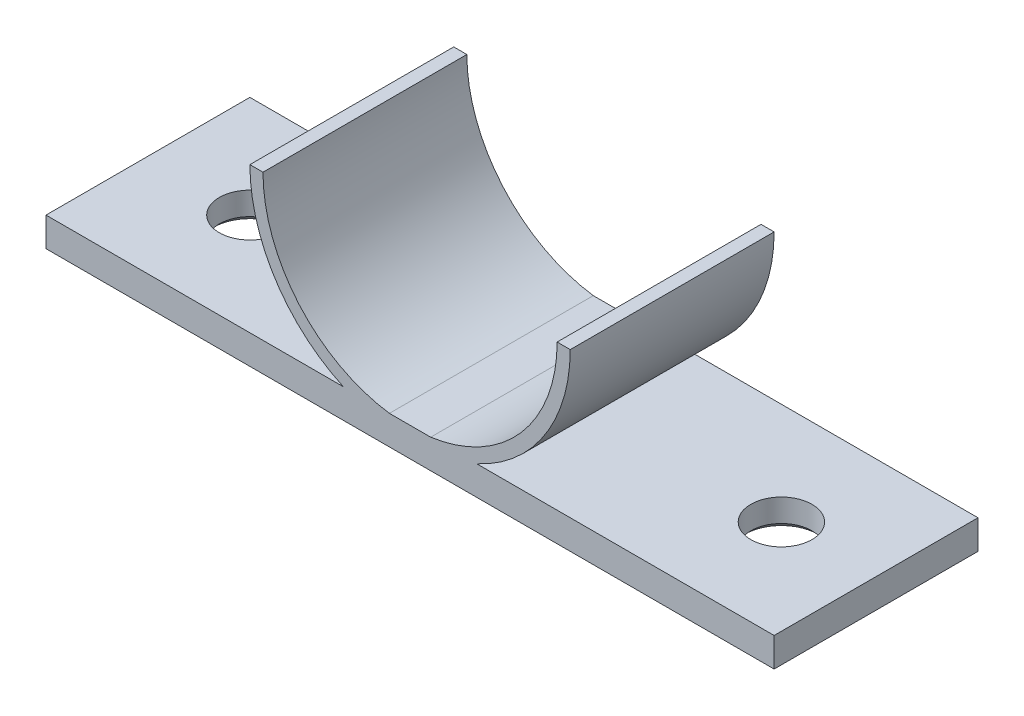
ISO-10303-21;
HEADER;
FILE_DESCRIPTION(('STEP AP214'),'2;1');
FILE_NAME('part.step','',(''),(''),'','','');
FILE_SCHEMA(('AUTOMOTIVE_DESIGN { 1 0 10303 214 1 1 1 1 }'));
ENDSEC;
DATA;
#1=APPLICATION_CONTEXT('core data for automotive mechanical design processes');
#2=APPLICATION_PROTOCOL_DEFINITION('international standard','automotive_design',2000,#1);
#3=PRODUCT_CONTEXT('',#1,'mechanical');
#4=PRODUCT('Part','Part','',(#3));
#5=PRODUCT_RELATED_PRODUCT_CATEGORY('part','',(#4));
#6=PRODUCT_DEFINITION_FORMATION('','',#4);
#7=PRODUCT_DEFINITION_CONTEXT('part definition',#1,'design');
#8=PRODUCT_DEFINITION('design','',#6,#7);
#9=PRODUCT_DEFINITION_SHAPE('','',#8);
#10=(LENGTH_UNIT() NAMED_UNIT(*) SI_UNIT(.MILLI.,.METRE.));
#11=(NAMED_UNIT(*) PLANE_ANGLE_UNIT() SI_UNIT($,.RADIAN.));
#12=(NAMED_UNIT(*) SI_UNIT($,.STERADIAN.) SOLID_ANGLE_UNIT());
#13=UNCERTAINTY_MEASURE_WITH_UNIT(LENGTH_MEASURE(1.E-05),#10,'distance_accuracy_value','');
#14=(GEOMETRIC_REPRESENTATION_CONTEXT(3) GLOBAL_UNCERTAINTY_ASSIGNED_CONTEXT((#13)) GLOBAL_UNIT_ASSIGNED_CONTEXT((#10,
#11,#12)) REPRESENTATION_CONTEXT('',''));
#15=CARTESIAN_POINT('',(0.,0.,0.));
#16=DIRECTION('',(0.,0.,1.));
#17=DIRECTION('',(1.,0.,0.));
#18=AXIS2_PLACEMENT_3D('',#15,#16,#17);
#19=CARTESIAN_POINT('',(0.,2.,0.));
#20=DIRECTION('',(0.,-1.,0.));
#21=DIRECTION('',(0.,0.,-1.));
#22=AXIS2_PLACEMENT_3D('',#19,#20,#21);
#23=PLANE('',#22);
#24=DIRECTION('',(1.,0.,0.));
#25=VECTOR('',#24,1.);
#26=CARTESIAN_POINT('',(0.,2.,0.));
#27=LINE('',#26,#25);
#28=CARTESIAN_POINT('',(23.5822553121243,2.,0.));
#29=VERTEX_POINT('',#28);
#30=CARTESIAN_POINT('',(26.4177446878757,2.,0.));
#31=VERTEX_POINT('',#30);
#32=EDGE_CURVE('E63',#29,#31,#27,.T.);
#33=ORIENTED_EDGE('',*,*,#32,.T.);
#34=DIRECTION('',(0.,0.,1.));
#35=VECTOR('',#34,1.);
#36=CARTESIAN_POINT('',(26.4177446878757,2.,-14.));
#37=LINE('',#36,#35);
#38=CARTESIAN_POINT('',(26.4177446878757,2.,-14.));
#39=VERTEX_POINT('',#38);
#40=EDGE_CURVE('E67',#39,#31,#37,.T.);
#41=ORIENTED_EDGE('',*,*,#40,.F.);
#42=DIRECTION('',(-1.,0.,0.));
#43=VECTOR('',#42,1.);
#44=CARTESIAN_POINT('',(0.,2.,-14.));
#45=LINE('',#44,#43);
#46=CARTESIAN_POINT('',(23.5822553121243,2.,-14.));
#47=VERTEX_POINT('',#46);
#48=EDGE_CURVE('E230',#39,#47,#45,.T.);
#49=ORIENTED_EDGE('',*,*,#48,.T.);
#50=DIRECTION('',(0.,0.,1.));
#51=VECTOR('',#50,1.);
#52=CARTESIAN_POINT('',(23.5822553121243,2.,-14.));
#53=LINE('',#52,#51);
#54=EDGE_CURVE('E207',#47,#29,#53,.T.);
#55=ORIENTED_EDGE('',*,*,#54,.T.);
#56=EDGE_LOOP('',(#33,#41,#49,#55));
#57=FACE_BOUND('',#56,.T.);
#58=ADVANCED_FACE('F45',(#57),#23,.F.);
#59=CARTESIAN_POINT('',(7.,2.,-7.));
#60=DIRECTION('',(0.,-1.,0.));
#61=DIRECTION('',(0.,0.,-1.));
#62=AXIS2_PLACEMENT_3D('',#59,#60,#61);
#63=CIRCLE('',#62,2.09999999999999);
#64=CARTESIAN_POINT('',(7.,2.,-9.09999999999999));
#65=VERTEX_POINT('',#64);
#66=EDGE_CURVE('E49',#65,#65,#63,.T.);
#67=ORIENTED_EDGE('',*,*,#66,.T.);
#68=EDGE_LOOP('',(#67));
#69=FACE_BOUND('',#68,.T.);
#70=DIRECTION('',(0.,0.,1.));
#71=VECTOR('',#70,1.);
#72=CARTESIAN_POINT('',(20.4174243050442,2.,-14.));
#73=LINE('',#72,#71);
#74=CARTESIAN_POINT('',(20.4174243050442,2.,-14.));
#75=VERTEX_POINT('',#74);
#76=CARTESIAN_POINT('',(20.4174243050442,2.,0.));
#77=VERTEX_POINT('',#76);
#78=EDGE_CURVE('E189',#75,#77,#73,.T.);
#79=ORIENTED_EDGE('',*,*,#78,.F.);
#80=CARTESIAN_POINT('',(0.,2.,-14.));
#81=VERTEX_POINT('',#80);
#82=EDGE_CURVE('E225',#75,#81,#45,.T.);
#83=ORIENTED_EDGE('',*,*,#82,.T.);
#84=DIRECTION('',(0.,0.,1.));
#85=VECTOR('',#84,1.);
#86=CARTESIAN_POINT('',(0.,2.,0.));
#87=LINE('',#86,#85);
#88=CARTESIAN_POINT('',(0.,2.,0.));
#89=VERTEX_POINT('',#88);
#90=EDGE_CURVE('E212',#81,#89,#87,.T.);
#91=ORIENTED_EDGE('',*,*,#90,.T.);
#92=EDGE_CURVE('E218',#89,#77,#27,.T.);
#93=ORIENTED_EDGE('',*,*,#92,.T.);
#94=EDGE_LOOP('',(#79,#83,#91,#93));
#95=FACE_BOUND('',#94,.T.);
#96=ADVANCED_FACE('F288',(#69,#95),#23,.F.);
#97=CARTESIAN_POINT('',(0.,2.,0.));
#98=DIRECTION('',(1.,0.,0.));
#99=DIRECTION('',(0.,0.,-1.));
#100=AXIS2_PLACEMENT_3D('',#97,#98,#99);
#101=PLANE('',#100);
#102=DIRECTION('',(0.,0.,1.));
#103=VECTOR('',#102,1.);
#104=CARTESIAN_POINT('',(0.,0.,0.));
#105=LINE('',#104,#103);
#106=CARTESIAN_POINT('',(0.,0.,-14.));
#107=VERTEX_POINT('',#106);
#108=CARTESIAN_POINT('',(0.,0.,0.));
#109=VERTEX_POINT('',#108);
#110=EDGE_CURVE('E203',#107,#109,#105,.T.);
#111=ORIENTED_EDGE('',*,*,#110,.T.);
#112=DIRECTION('',(0.,-1.,0.));
#113=VECTOR('',#112,1.);
#114=CARTESIAN_POINT('',(0.,2.,0.));
#115=LINE('',#114,#113);
#116=EDGE_CURVE('E11',#89,#109,#115,.T.);
#117=ORIENTED_EDGE('',*,*,#116,.F.);
#118=ORIENTED_EDGE('',*,*,#90,.F.);
#119=DIRECTION('',(0.,-1.,0.));
#120=VECTOR('',#119,1.);
#121=CARTESIAN_POINT('',(0.,2.,-14.));
#122=LINE('',#121,#120);
#123=EDGE_CURVE('E229',#81,#107,#122,.T.);
#124=ORIENTED_EDGE('',*,*,#123,.T.);
#125=EDGE_LOOP('',(#111,#117,#118,#124));
#126=FACE_BOUND('',#125,.T.);
#127=ADVANCED_FACE('F47',(#126),#101,.F.);
#128=CARTESIAN_POINT('',(0.,2.,0.));
#129=DIRECTION('',(0.,0.,-1.));
#130=DIRECTION('',(-1.,0.,0.));
#131=AXIS2_PLACEMENT_3D('',#128,#129,#130);
#132=PLANE('',#131);
#133=DIRECTION('',(1.,0.,0.));
#134=VECTOR('',#133,1.);
#135=CARTESIAN_POINT('',(0.,0.,0.));
#136=LINE('',#135,#134);
#137=CARTESIAN_POINT('',(50.,0.,0.));
#138=VERTEX_POINT('',#137);
#139=EDGE_CURVE('E234',#109,#138,#136,.T.);
#140=ORIENTED_EDGE('',*,*,#139,.T.);
#141=DIRECTION('',(0.,-1.,0.));
#142=VECTOR('',#141,1.);
#143=CARTESIAN_POINT('',(50.,2.,0.));
#144=LINE('',#143,#142);
#145=CARTESIAN_POINT('',(50.,2.,0.));
#146=VERTEX_POINT('',#145);
#147=EDGE_CURVE('E55',#146,#138,#144,.T.);
#148=ORIENTED_EDGE('',*,*,#147,.F.);
#149=CARTESIAN_POINT('',(29.5825756949558,2.,0.));
#150=VERTEX_POINT('',#149);
#151=EDGE_CURVE('E216',#150,#146,#27,.T.);
#152=ORIENTED_EDGE('',*,*,#151,.F.);
#153=CARTESIAN_POINT('',(25.,12.,0.));
#154=DIRECTION('',(0.,0.,1.));
#155=DIRECTION('',(1.,0.,0.));
#156=AXIS2_PLACEMENT_3D('',#153,#154,#155);
#157=CIRCLE('',#156,11.);
#158=CARTESIAN_POINT('',(36.,12.,0.));
#159=VERTEX_POINT('',#158);
#160=EDGE_CURVE('E156',#150,#159,#157,.T.);
#161=ORIENTED_EDGE('',*,*,#160,.T.);
#162=DIRECTION('',(-1.,0.,0.));
#163=VECTOR('',#162,1.);
#164=CARTESIAN_POINT('',(36.,12.,0.));
#165=LINE('',#164,#163);
#166=CARTESIAN_POINT('',(35.1,12.,0.));
#167=VERTEX_POINT('',#166);
#168=EDGE_CURVE('E140',#159,#167,#165,.T.);
#169=ORIENTED_EDGE('',*,*,#168,.T.);
#170=CARTESIAN_POINT('',(25.,12.,0.));
#171=DIRECTION('',(0.,0.,-1.));
#172=DIRECTION('',(1.,0.,0.));
#173=AXIS2_PLACEMENT_3D('',#170,#171,#172);
#174=CIRCLE('',#173,10.1);
#175=EDGE_CURVE('E151',#167,#31,#174,.T.);
#176=ORIENTED_EDGE('',*,*,#175,.T.);
#177=ORIENTED_EDGE('',*,*,#32,.F.);
#178=CARTESIAN_POINT('',(25.,12.,0.));
#179=DIRECTION('',(0.,0.,-1.));
#180=DIRECTION('',(1.,0.,0.));
#181=AXIS2_PLACEMENT_3D('',#178,#179,#180);
#182=CIRCLE('',#181,10.1);
#183=CARTESIAN_POINT('',(14.9,12.,0.));
#184=VERTEX_POINT('',#183);
#185=EDGE_CURVE('E193',#29,#184,#182,.T.);
#186=ORIENTED_EDGE('',*,*,#185,.T.);
#187=DIRECTION('',(-1.,0.,0.));
#188=VECTOR('',#187,1.);
#189=CARTESIAN_POINT('',(14.,12.,0.));
#190=LINE('',#189,#188);
#191=CARTESIAN_POINT('',(14.,12.,0.));
#192=VERTEX_POINT('',#191);
#193=EDGE_CURVE('E181',#184,#192,#190,.T.);
#194=ORIENTED_EDGE('',*,*,#193,.T.);
#195=CARTESIAN_POINT('',(25.,12.,0.));
#196=DIRECTION('',(0.,0.,1.));
#197=DIRECTION('',(1.,0.,0.));
#198=AXIS2_PLACEMENT_3D('',#195,#196,#197);
#199=CIRCLE('',#198,11.);
#200=EDGE_CURVE('E155',#192,#77,#199,.T.);
#201=ORIENTED_EDGE('',*,*,#200,.T.);
#202=ORIENTED_EDGE('',*,*,#92,.F.);
#203=ORIENTED_EDGE('',*,*,#116,.T.);
#204=EDGE_LOOP('',(#140,#148,#152,#161,#169,#176,#177,#186,#194,#201,#202,#203));
#205=FACE_BOUND('',#204,.T.);
#206=ADVANCED_FACE('F159',(#205),#132,.F.);
#207=CARTESIAN_POINT('',(50.,2.,0.));
#208=DIRECTION('',(-1.,0.,0.));
#209=DIRECTION('',(0.,0.,1.));
#210=AXIS2_PLACEMENT_3D('',#207,#208,#209);
#211=PLANE('',#210);
#212=DIRECTION('',(0.,0.,-1.));
#213=VECTOR('',#212,1.);
#214=CARTESIAN_POINT('',(50.,0.,0.));
#215=LINE('',#214,#213);
#216=CARTESIAN_POINT('',(50.,0.,-14.));
#217=VERTEX_POINT('',#216);
#218=EDGE_CURVE('E237',#138,#217,#215,.T.);
#219=ORIENTED_EDGE('',*,*,#218,.T.);
#220=DIRECTION('',(0.,-1.,0.));
#221=VECTOR('',#220,1.);
#222=CARTESIAN_POINT('',(50.,2.,-14.));
#223=LINE('',#222,#221);
#224=CARTESIAN_POINT('',(50.,2.,-14.));
#225=VERTEX_POINT('',#224);
#226=EDGE_CURVE('E244',#225,#217,#223,.T.);
#227=ORIENTED_EDGE('',*,*,#226,.F.);
#228=DIRECTION('',(0.,0.,-1.));
#229=VECTOR('',#228,1.);
#230=CARTESIAN_POINT('',(50.,2.,0.));
#231=LINE('',#230,#229);
#232=EDGE_CURVE('E222',#146,#225,#231,.T.);
#233=ORIENTED_EDGE('',*,*,#232,.F.);
#234=ORIENTED_EDGE('',*,*,#147,.T.);
#235=EDGE_LOOP('',(#219,#227,#233,#234));
#236=FACE_BOUND('',#235,.T.);
#237=ADVANCED_FACE('F312',(#236),#211,.F.);
#238=CARTESIAN_POINT('',(0.,2.,-14.));
#239=DIRECTION('',(0.,0.,1.));
#240=DIRECTION('',(1.,0.,0.));
#241=AXIS2_PLACEMENT_3D('',#238,#239,#240);
#242=PLANE('',#241);
#243=DIRECTION('',(-1.,0.,0.));
#244=VECTOR('',#243,1.);
#245=CARTESIAN_POINT('',(0.,0.,-14.));
#246=LINE('',#245,#244);
#247=EDGE_CURVE('E217',#217,#107,#246,.T.);
#248=ORIENTED_EDGE('',*,*,#247,.T.);
#249=ORIENTED_EDGE('',*,*,#123,.F.);
#250=ORIENTED_EDGE('',*,*,#82,.F.);
#251=CARTESIAN_POINT('',(25.,12.,-14.));
#252=DIRECTION('',(0.,0.,1.));
#253=DIRECTION('',(1.,0.,0.));
#254=AXIS2_PLACEMENT_3D('',#251,#252,#253);
#255=CIRCLE('',#254,11.);
#256=CARTESIAN_POINT('',(14.,12.,-14.));
#257=VERTEX_POINT('',#256);
#258=EDGE_CURVE('E178',#257,#75,#255,.T.);
#259=ORIENTED_EDGE('',*,*,#258,.F.);
#260=DIRECTION('',(-1.,0.,0.));
#261=VECTOR('',#260,1.);
#262=CARTESIAN_POINT('',(14.,12.,-14.));
#263=LINE('',#262,#261);
#264=CARTESIAN_POINT('',(14.9,12.,-14.));
#265=VERTEX_POINT('',#264);
#266=EDGE_CURVE('E185',#265,#257,#263,.T.);
#267=ORIENTED_EDGE('',*,*,#266,.F.);
#268=CARTESIAN_POINT('',(25.,12.,-14.));
#269=DIRECTION('',(0.,0.,-1.));
#270=DIRECTION('',(1.,0.,0.));
#271=AXIS2_PLACEMENT_3D('',#268,#269,#270);
#272=CIRCLE('',#271,10.1);
#273=EDGE_CURVE('E180',#47,#265,#272,.T.);
#274=ORIENTED_EDGE('',*,*,#273,.F.);
#275=ORIENTED_EDGE('',*,*,#48,.F.);
#276=CARTESIAN_POINT('',(25.,12.,-14.));
#277=DIRECTION('',(0.,0.,-1.));
#278=DIRECTION('',(1.,0.,0.));
#279=AXIS2_PLACEMENT_3D('',#276,#277,#278);
#280=CIRCLE('',#279,10.1);
#281=CARTESIAN_POINT('',(35.1,12.,-14.));
#282=VERTEX_POINT('',#281);
#283=EDGE_CURVE('E162',#282,#39,#280,.T.);
#284=ORIENTED_EDGE('',*,*,#283,.F.);
#285=DIRECTION('',(-1.,0.,0.));
#286=VECTOR('',#285,1.);
#287=CARTESIAN_POINT('',(36.,12.,-14.));
#288=LINE('',#287,#286);
#289=CARTESIAN_POINT('',(36.,12.,-14.));
#290=VERTEX_POINT('',#289);
#291=EDGE_CURVE('E142',#290,#282,#288,.T.);
#292=ORIENTED_EDGE('',*,*,#291,.F.);
#293=CARTESIAN_POINT('',(25.,12.,-14.));
#294=DIRECTION('',(0.,0.,1.));
#295=DIRECTION('',(1.,0.,0.));
#296=AXIS2_PLACEMENT_3D('',#293,#294,#295);
#297=CIRCLE('',#296,11.);
#298=CARTESIAN_POINT('',(29.5825756949558,2.,-14.));
#299=VERTEX_POINT('',#298);
#300=EDGE_CURVE('E169',#299,#290,#297,.T.);
#301=ORIENTED_EDGE('',*,*,#300,.F.);
#302=EDGE_CURVE('E226',#225,#299,#45,.T.);
#303=ORIENTED_EDGE('',*,*,#302,.F.);
#304=ORIENTED_EDGE('',*,*,#226,.T.);
#305=EDGE_LOOP('',(#248,#249,#250,#259,#267,#274,#275,#284,#292,#301,#303,#304));
#306=FACE_BOUND('',#305,.T.);
#307=ADVANCED_FACE('F278',(#306),#242,.F.);
#308=CARTESIAN_POINT('',(43.5,2.,-7.));
#309=DIRECTION('',(0.,-1.,0.));
#310=DIRECTION('',(0.,0.,-1.));
#311=AXIS2_PLACEMENT_3D('',#308,#309,#310);
#312=CIRCLE('',#311,2.09999999999999);
#313=CARTESIAN_POINT('',(43.5,2.,-9.09999999999999));
#314=VERTEX_POINT('',#313);
#315=EDGE_CURVE('E148',#314,#314,#312,.T.);
#316=ORIENTED_EDGE('',*,*,#315,.T.);
#317=EDGE_LOOP('',(#316));
#318=FACE_BOUND('',#317,.T.);
#319=ORIENTED_EDGE('',*,*,#302,.T.);
#320=DIRECTION('',(0.,0.,1.));
#321=VECTOR('',#320,1.);
#322=CARTESIAN_POINT('',(29.5825756949558,2.,-14.));
#323=LINE('',#322,#321);
#324=EDGE_CURVE('E268',#299,#150,#323,.T.);
#325=ORIENTED_EDGE('',*,*,#324,.T.);
#326=ORIENTED_EDGE('',*,*,#151,.T.);
#327=ORIENTED_EDGE('',*,*,#232,.T.);
#328=EDGE_LOOP('',(#319,#325,#326,#327));
#329=FACE_BOUND('',#328,.T.);
#330=ADVANCED_FACE('F307',(#318,#329),#23,.F.);
#331=CARTESIAN_POINT('',(0.,0.,0.));
#332=DIRECTION('',(0.,-1.,0.));
#333=DIRECTION('',(0.,0.,-1.));
#334=AXIS2_PLACEMENT_3D('',#331,#332,#333);
#335=PLANE('',#334);
#336=CARTESIAN_POINT('',(7.,0.,-7.));
#337=DIRECTION('',(0.,-1.,0.));
#338=DIRECTION('',(0.,0.,-1.));
#339=AXIS2_PLACEMENT_3D('',#336,#337,#338);
#340=CIRCLE('',#339,2.525);
#341=CARTESIAN_POINT('',(7.,0.,-9.525));
#342=VERTEX_POINT('',#341);
#343=EDGE_CURVE('E364',#342,#342,#340,.T.);
#344=ORIENTED_EDGE('',*,*,#343,.F.);
#345=EDGE_LOOP('',(#344));
#346=FACE_BOUND('',#345,.T.);
#347=CARTESIAN_POINT('',(43.5,0.,-7.));
#348=DIRECTION('',(0.,-1.,0.));
#349=DIRECTION('',(0.,0.,-1.));
#350=AXIS2_PLACEMENT_3D('',#347,#348,#349);
#351=CIRCLE('',#350,2.525);
#352=CARTESIAN_POINT('',(43.5,0.,-9.525));
#353=VERTEX_POINT('',#352);
#354=EDGE_CURVE('E257',#353,#353,#351,.T.);
#355=ORIENTED_EDGE('',*,*,#354,.F.);
#356=EDGE_LOOP('',(#355));
#357=FACE_BOUND('',#356,.T.);
#358=ORIENTED_EDGE('',*,*,#110,.F.);
#359=ORIENTED_EDGE('',*,*,#247,.F.);
#360=ORIENTED_EDGE('',*,*,#218,.F.);
#361=ORIENTED_EDGE('',*,*,#139,.F.);
#362=EDGE_LOOP('',(#358,#359,#360,#361));
#363=FACE_BOUND('',#362,.T.);
#364=ADVANCED_FACE('F314',(#346,#357,#363),#335,.T.);
#365=CARTESIAN_POINT('',(25.,12.,-14.));
#366=DIRECTION('',(0.,0.,1.));
#367=DIRECTION('',(1.,0.,0.));
#368=AXIS2_PLACEMENT_3D('',#365,#366,#367);
#369=CYLINDRICAL_SURFACE('',#368,11.);
#370=ORIENTED_EDGE('',*,*,#200,.F.);
#371=DIRECTION('',(0.,0.,1.));
#372=VECTOR('',#371,1.);
#373=CARTESIAN_POINT('',(14.,12.,-14.));
#374=LINE('',#373,#372);
#375=EDGE_CURVE('E200',#257,#192,#374,.T.);
#376=ORIENTED_EDGE('',*,*,#375,.F.);
#377=ORIENTED_EDGE('',*,*,#258,.T.);
#378=ORIENTED_EDGE('',*,*,#78,.T.);
#379=EDGE_LOOP('',(#370,#376,#377,#378));
#380=FACE_BOUND('',#379,.T.);
#381=ADVANCED_FACE('F299',(#380),#369,.T.);
#382=CARTESIAN_POINT('',(14.,12.,-14.));
#383=DIRECTION('',(0.,1.,0.));
#384=DIRECTION('',(0.,0.,1.));
#385=AXIS2_PLACEMENT_3D('',#382,#383,#384);
#386=PLANE('',#385);
#387=ORIENTED_EDGE('',*,*,#193,.F.);
#388=DIRECTION('',(0.,0.,1.));
#389=VECTOR('',#388,1.);
#390=CARTESIAN_POINT('',(14.9,12.,-14.));
#391=LINE('',#390,#389);
#392=EDGE_CURVE('E204',#265,#184,#391,.T.);
#393=ORIENTED_EDGE('',*,*,#392,.F.);
#394=ORIENTED_EDGE('',*,*,#266,.T.);
#395=ORIENTED_EDGE('',*,*,#375,.T.);
#396=EDGE_LOOP('',(#387,#393,#394,#395));
#397=FACE_BOUND('',#396,.T.);
#398=ADVANCED_FACE('F301',(#397),#386,.T.);
#399=CARTESIAN_POINT('',(25.,12.,-14.));
#400=DIRECTION('',(0.,0.,1.));
#401=DIRECTION('',(1.,0.,0.));
#402=AXIS2_PLACEMENT_3D('',#399,#400,#401);
#403=CYLINDRICAL_SURFACE('',#402,10.1);
#404=ORIENTED_EDGE('',*,*,#185,.F.);
#405=ORIENTED_EDGE('',*,*,#54,.F.);
#406=ORIENTED_EDGE('',*,*,#273,.T.);
#407=ORIENTED_EDGE('',*,*,#392,.T.);
#408=EDGE_LOOP('',(#404,#405,#406,#407));
#409=FACE_BOUND('',#408,.T.);
#410=ADVANCED_FACE('F303',(#409),#403,.F.);
#411=CARTESIAN_POINT('',(25.,12.,-14.));
#412=DIRECTION('',(0.,0.,1.));
#413=DIRECTION('',(1.,0.,0.));
#414=AXIS2_PLACEMENT_3D('',#411,#412,#413);
#415=CYLINDRICAL_SURFACE('',#414,10.1);
#416=ORIENTED_EDGE('',*,*,#175,.F.);
#417=DIRECTION('',(0.,0.,1.));
#418=VECTOR('',#417,1.);
#419=CARTESIAN_POINT('',(35.1,12.,-14.));
#420=LINE('',#419,#418);
#421=EDGE_CURVE('E136',#282,#167,#420,.T.);
#422=ORIENTED_EDGE('',*,*,#421,.F.);
#423=ORIENTED_EDGE('',*,*,#283,.T.);
#424=ORIENTED_EDGE('',*,*,#40,.T.);
#425=EDGE_LOOP('',(#416,#422,#423,#424));
#426=FACE_BOUND('',#425,.T.);
#427=ADVANCED_FACE('F152',(#426),#415,.F.);
#428=CARTESIAN_POINT('',(36.,12.,-14.));
#429=DIRECTION('',(0.,1.,0.));
#430=DIRECTION('',(0.,0.,1.));
#431=AXIS2_PLACEMENT_3D('',#428,#429,#430);
#432=PLANE('',#431);
#433=ORIENTED_EDGE('',*,*,#168,.F.);
#434=DIRECTION('',(0.,0.,1.));
#435=VECTOR('',#434,1.);
#436=CARTESIAN_POINT('',(36.,12.,-14.));
#437=LINE('',#436,#435);
#438=EDGE_CURVE('E147',#290,#159,#437,.T.);
#439=ORIENTED_EDGE('',*,*,#438,.F.);
#440=ORIENTED_EDGE('',*,*,#291,.T.);
#441=ORIENTED_EDGE('',*,*,#421,.T.);
#442=EDGE_LOOP('',(#433,#439,#440,#441));
#443=FACE_BOUND('',#442,.T.);
#444=ADVANCED_FACE('F138',(#443),#432,.T.);
#445=CARTESIAN_POINT('',(25.,12.,-14.));
#446=DIRECTION('',(0.,0.,1.));
#447=DIRECTION('',(1.,0.,0.));
#448=AXIS2_PLACEMENT_3D('',#445,#446,#447);
#449=CYLINDRICAL_SURFACE('',#448,11.);
#450=ORIENTED_EDGE('',*,*,#160,.F.);
#451=ORIENTED_EDGE('',*,*,#324,.F.);
#452=ORIENTED_EDGE('',*,*,#300,.T.);
#453=ORIENTED_EDGE('',*,*,#438,.T.);
#454=EDGE_LOOP('',(#450,#451,#452,#453));
#455=FACE_BOUND('',#454,.T.);
#456=ADVANCED_FACE('F273',(#455),#449,.T.);
#457=CARTESIAN_POINT('',(43.5,0.,-7.));
#458=DIRECTION('',(0.,-1.,0.));
#459=DIRECTION('',(0.,0.,-1.));
#460=AXIS2_PLACEMENT_3D('',#457,#458,#459);
#461=CYLINDRICAL_SURFACE('',#460,2.09999999999999);
#462=CARTESIAN_POINT('',(43.5,0.424999999999995,-7.));
#463=DIRECTION('',(0.,-1.,0.));
#464=DIRECTION('',(0.,0.,-1.));
#465=AXIS2_PLACEMENT_3D('',#462,#463,#464);
#466=CIRCLE('',#465,2.09999999999999);
#467=CARTESIAN_POINT('',(43.5,0.424999999999995,-9.09999999999999));
#468=VERTEX_POINT('',#467);
#469=EDGE_CURVE('E252',#468,#468,#466,.T.);
#470=ORIENTED_EDGE('',*,*,#469,.T.);
#471=EDGE_LOOP('',(#470));
#472=FACE_BOUND('',#471,.T.);
#473=ORIENTED_EDGE('',*,*,#315,.F.);
#474=EDGE_LOOP('',(#473));
#475=FACE_BOUND('',#474,.T.);
#476=ADVANCED_FACE('F341',(#472,#475),#461,.F.);
#477=CARTESIAN_POINT('',(43.5,0.,-7.));
#478=DIRECTION('',(0.,-1.,0.));
#479=DIRECTION('',(0.,0.,-1.));
#480=AXIS2_PLACEMENT_3D('',#477,#478,#479);
#481=CONICAL_SURFACE('',#480,2.525,0.785398163397463);
#482=ORIENTED_EDGE('',*,*,#469,.F.);
#483=EDGE_LOOP('',(#482));
#484=FACE_BOUND('',#483,.T.);
#485=ORIENTED_EDGE('',*,*,#354,.T.);
#486=EDGE_LOOP('',(#485));
#487=FACE_BOUND('',#486,.T.);
#488=ADVANCED_FACE('F346',(#484,#487),#481,.F.);
#489=CARTESIAN_POINT('',(7.,0.,-7.));
#490=DIRECTION('',(0.,-1.,0.));
#491=DIRECTION('',(0.,0.,-1.));
#492=AXIS2_PLACEMENT_3D('',#489,#490,#491);
#493=CYLINDRICAL_SURFACE('',#492,2.09999999999999);
#494=CARTESIAN_POINT('',(7.,0.424999999999995,-7.));
#495=DIRECTION('',(0.,-1.,0.));
#496=DIRECTION('',(0.,0.,-1.));
#497=AXIS2_PLACEMENT_3D('',#494,#495,#496);
#498=CIRCLE('',#497,2.09999999999999);
#499=CARTESIAN_POINT('',(7.,0.424999999999995,-9.09999999999999));
#500=VERTEX_POINT('',#499);
#501=EDGE_CURVE('E362',#500,#500,#498,.T.);
#502=ORIENTED_EDGE('',*,*,#501,.T.);
#503=EDGE_LOOP('',(#502));
#504=FACE_BOUND('',#503,.T.);
#505=ORIENTED_EDGE('',*,*,#66,.F.);
#506=EDGE_LOOP('',(#505));
#507=FACE_BOUND('',#506,.T.);
#508=ADVANCED_FACE('F349',(#504,#507),#493,.F.);
#509=CARTESIAN_POINT('',(7.,0.,-7.));
#510=DIRECTION('',(0.,-1.,0.));
#511=DIRECTION('',(0.,0.,-1.));
#512=AXIS2_PLACEMENT_3D('',#509,#510,#511);
#513=CONICAL_SURFACE('',#512,2.525,0.785398163397463);
#514=ORIENTED_EDGE('',*,*,#501,.F.);
#515=EDGE_LOOP('',(#514));
#516=FACE_BOUND('',#515,.T.);
#517=ORIENTED_EDGE('',*,*,#343,.T.);
#518=EDGE_LOOP('',(#517));
#519=FACE_BOUND('',#518,.T.);
#520=ADVANCED_FACE('F353',(#516,#519),#513,.F.);
#521=CLOSED_SHELL('',(#58,#96,#127,#206,#237,#307,#330,#364,#381,#398,#410,#427,#444,#456,#476,
#488,#508,#520));
#522=MANIFOLD_SOLID_BREP('B2',#521);
#523=ADVANCED_BREP_SHAPE_REPRESENTATION('',(#18,#522),#14);
#524=SHAPE_DEFINITION_REPRESENTATION(#9,#523);
ENDSEC;
END-ISO-10303-21;
